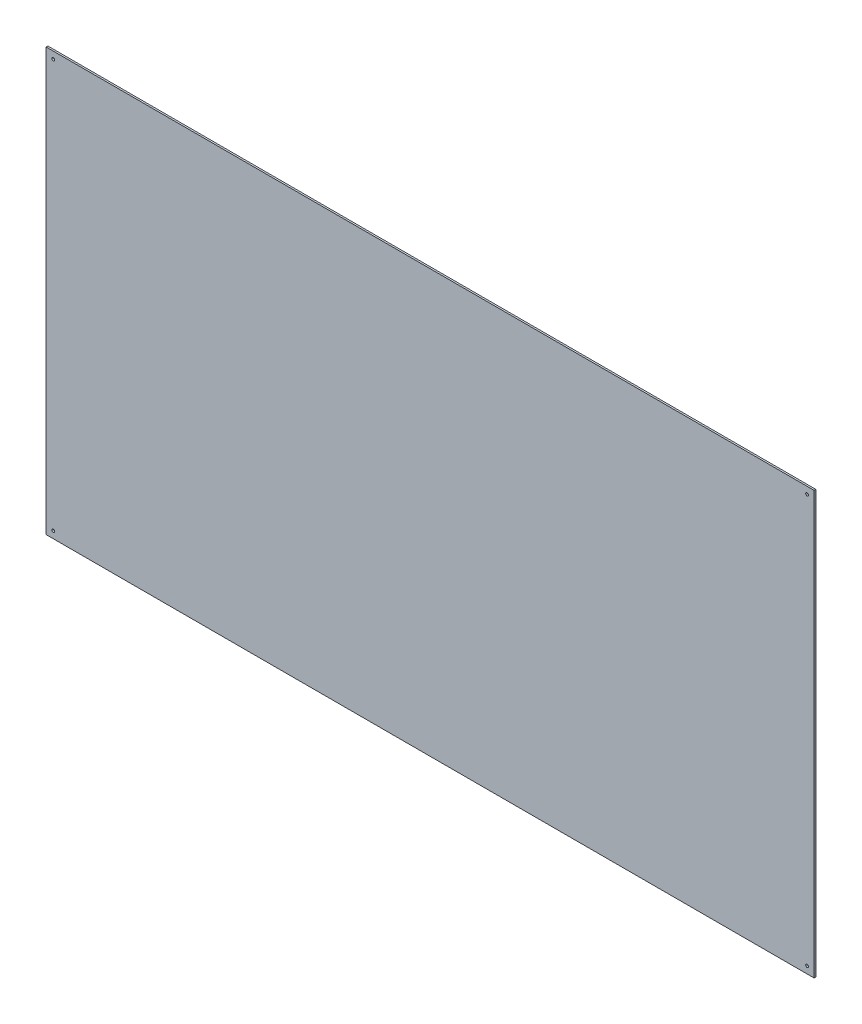
ISO-10303-21;
HEADER;
FILE_DESCRIPTION(('STEP AP214'),'2;1');
FILE_NAME('part.step','',(''),(''),'','','');
FILE_SCHEMA(('AUTOMOTIVE_DESIGN { 1 0 10303 214 1 1 1 1 }'));
ENDSEC;
DATA;
#1=APPLICATION_CONTEXT('core data for automotive mechanical design processes');
#2=APPLICATION_PROTOCOL_DEFINITION('international standard','automotive_design',2000,#1);
#3=PRODUCT_CONTEXT('',#1,'mechanical');
#4=PRODUCT('Part','Part','',(#3));
#5=PRODUCT_RELATED_PRODUCT_CATEGORY('part','',(#4));
#6=PRODUCT_DEFINITION_FORMATION('','',#4);
#7=PRODUCT_DEFINITION_CONTEXT('part definition',#1,'design');
#8=PRODUCT_DEFINITION('design','',#6,#7);
#9=PRODUCT_DEFINITION_SHAPE('','',#8);
#10=(LENGTH_UNIT() NAMED_UNIT(*) SI_UNIT(.MILLI.,.METRE.));
#11=(NAMED_UNIT(*) PLANE_ANGLE_UNIT() SI_UNIT($,.RADIAN.));
#12=(NAMED_UNIT(*) SI_UNIT($,.STERADIAN.) SOLID_ANGLE_UNIT());
#13=UNCERTAINTY_MEASURE_WITH_UNIT(LENGTH_MEASURE(1.E-05),#10,'distance_accuracy_value','');
#14=(GEOMETRIC_REPRESENTATION_CONTEXT(3) GLOBAL_UNCERTAINTY_ASSIGNED_CONTEXT((#13)) GLOBAL_UNIT_ASSIGNED_CONTEXT((#10,
#11,#12)) REPRESENTATION_CONTEXT('',''));
#15=CARTESIAN_POINT('',(0.,0.,0.));
#16=DIRECTION('',(0.,0.,1.));
#17=DIRECTION('',(1.,0.,0.));
#18=AXIS2_PLACEMENT_3D('',#15,#16,#17);
#19=CARTESIAN_POINT('',(-1100.,605.,5.));
#20=DIRECTION('',(1.,0.,0.));
#21=DIRECTION('',(0.,0.,-1.));
#22=AXIS2_PLACEMENT_3D('',#19,#20,#21);
#23=PLANE('',#22);
#24=DIRECTION('',(0.,-1.,0.));
#25=VECTOR('',#24,1.);
#26=CARTESIAN_POINT('',(-1100.,605.,0.));
#27=LINE('',#26,#25);
#28=CARTESIAN_POINT('',(-1100.,605.,0.));
#29=VERTEX_POINT('',#28);
#30=CARTESIAN_POINT('',(-1100.,-605.,0.));
#31=VERTEX_POINT('',#30);
#32=EDGE_CURVE('E96',#29,#31,#27,.T.);
#33=ORIENTED_EDGE('',*,*,#32,.T.);
#34=DIRECTION('',(0.,0.,-1.));
#35=VECTOR('',#34,1.);
#36=CARTESIAN_POINT('',(-1100.,-605.,5.));
#37=LINE('',#36,#35);
#38=CARTESIAN_POINT('',(-1100.,-605.,5.));
#39=VERTEX_POINT('',#38);
#40=EDGE_CURVE('E11',#39,#31,#37,.T.);
#41=ORIENTED_EDGE('',*,*,#40,.F.);
#42=DIRECTION('',(0.,-1.,0.));
#43=VECTOR('',#42,1.);
#44=CARTESIAN_POINT('',(-1100.,605.,5.));
#45=LINE('',#44,#43);
#46=CARTESIAN_POINT('',(-1100.,605.,5.));
#47=VERTEX_POINT('',#46);
#48=EDGE_CURVE('E84',#47,#39,#45,.T.);
#49=ORIENTED_EDGE('',*,*,#48,.F.);
#50=DIRECTION('',(0.,0.,-1.));
#51=VECTOR('',#50,1.);
#52=CARTESIAN_POINT('',(-1100.,605.,5.));
#53=LINE('',#52,#51);
#54=EDGE_CURVE('E92',#47,#29,#53,.T.);
#55=ORIENTED_EDGE('',*,*,#54,.T.);
#56=EDGE_LOOP('',(#33,#41,#49,#55));
#57=FACE_BOUND('',#56,.T.);
#58=ADVANCED_FACE('F33',(#57),#23,.F.);
#59=CARTESIAN_POINT('',(-1100.,-605.,5.));
#60=DIRECTION('',(0.,1.,0.));
#61=DIRECTION('',(-1.,0.,0.));
#62=AXIS2_PLACEMENT_3D('',#59,#60,#61);
#63=PLANE('',#62);
#64=DIRECTION('',(1.,0.,0.));
#65=VECTOR('',#64,1.);
#66=CARTESIAN_POINT('',(-1100.,-605.,0.));
#67=LINE('',#66,#65);
#68=CARTESIAN_POINT('',(1100.,-605.,0.));
#69=VERTEX_POINT('',#68);
#70=EDGE_CURVE('E88',#31,#69,#67,.T.);
#71=ORIENTED_EDGE('',*,*,#70,.T.);
#72=DIRECTION('',(0.,0.,-1.));
#73=VECTOR('',#72,1.);
#74=CARTESIAN_POINT('',(1100.,-605.,5.));
#75=LINE('',#74,#73);
#76=CARTESIAN_POINT('',(1100.,-605.,5.));
#77=VERTEX_POINT('',#76);
#78=EDGE_CURVE('E41',#77,#69,#75,.T.);
#79=ORIENTED_EDGE('',*,*,#78,.F.);
#80=DIRECTION('',(1.,0.,0.));
#81=VECTOR('',#80,1.);
#82=CARTESIAN_POINT('',(-1100.,-605.,5.));
#83=LINE('',#82,#81);
#84=EDGE_CURVE('E79',#39,#77,#83,.T.);
#85=ORIENTED_EDGE('',*,*,#84,.F.);
#86=ORIENTED_EDGE('',*,*,#40,.T.);
#87=EDGE_LOOP('',(#71,#79,#85,#86));
#88=FACE_BOUND('',#87,.T.);
#89=ADVANCED_FACE('F87',(#88),#63,.F.);
#90=CARTESIAN_POINT('',(1100.,605.,5.));
#91=DIRECTION('',(-1.,0.,0.));
#92=DIRECTION('',(0.,-1.,0.));
#93=AXIS2_PLACEMENT_3D('',#90,#91,#92);
#94=PLANE('',#93);
#95=DIRECTION('',(0.,1.,0.));
#96=VECTOR('',#95,1.);
#97=CARTESIAN_POINT('',(1100.,605.,0.));
#98=LINE('',#97,#96);
#99=CARTESIAN_POINT('',(1100.,605.,0.));
#100=VERTEX_POINT('',#99);
#101=EDGE_CURVE('E66',#69,#100,#98,.T.);
#102=ORIENTED_EDGE('',*,*,#101,.T.);
#103=DIRECTION('',(0.,0.,-1.));
#104=VECTOR('',#103,1.);
#105=CARTESIAN_POINT('',(1100.,605.,5.));
#106=LINE('',#105,#104);
#107=CARTESIAN_POINT('',(1100.,605.,5.));
#108=VERTEX_POINT('',#107);
#109=EDGE_CURVE('E89',#108,#100,#106,.T.);
#110=ORIENTED_EDGE('',*,*,#109,.F.);
#111=DIRECTION('',(0.,1.,0.));
#112=VECTOR('',#111,1.);
#113=CARTESIAN_POINT('',(1100.,605.,5.));
#114=LINE('',#113,#112);
#115=EDGE_CURVE('E82',#77,#108,#114,.T.);
#116=ORIENTED_EDGE('',*,*,#115,.F.);
#117=ORIENTED_EDGE('',*,*,#78,.T.);
#118=EDGE_LOOP('',(#102,#110,#116,#117));
#119=FACE_BOUND('',#118,.T.);
#120=ADVANCED_FACE('F90',(#119),#94,.F.);
#121=CARTESIAN_POINT('',(-1100.,605.,5.));
#122=DIRECTION('',(0.,-1.,0.));
#123=DIRECTION('',(1.,0.,0.));
#124=AXIS2_PLACEMENT_3D('',#121,#122,#123);
#125=PLANE('',#124);
#126=DIRECTION('',(-1.,0.,0.));
#127=VECTOR('',#126,1.);
#128=CARTESIAN_POINT('',(-1100.,605.,0.));
#129=LINE('',#128,#127);
#130=EDGE_CURVE('E72',#100,#29,#129,.T.);
#131=ORIENTED_EDGE('',*,*,#130,.T.);
#132=ORIENTED_EDGE('',*,*,#54,.F.);
#133=DIRECTION('',(-1.,0.,0.));
#134=VECTOR('',#133,1.);
#135=CARTESIAN_POINT('',(-1100.,605.,5.));
#136=LINE('',#135,#134);
#137=EDGE_CURVE('E49',#108,#47,#136,.T.);
#138=ORIENTED_EDGE('',*,*,#137,.F.);
#139=ORIENTED_EDGE('',*,*,#109,.T.);
#140=EDGE_LOOP('',(#131,#132,#138,#139));
#141=FACE_BOUND('',#140,.T.);
#142=ADVANCED_FACE('F104',(#141),#125,.F.);
#143=CARTESIAN_POINT('',(0.,0.,5.));
#144=DIRECTION('',(0.,0.,1.));
#145=DIRECTION('',(1.,0.,0.));
#146=AXIS2_PLACEMENT_3D('',#143,#144,#145);
#147=PLANE('',#146);
#148=CARTESIAN_POINT('',(1080.,585.,5.));
#149=DIRECTION('',(0.,0.,1.));
#150=DIRECTION('',(-1.,0.,0.));
#151=AXIS2_PLACEMENT_3D('',#148,#149,#150);
#152=CIRCLE('',#151,4.05000000000015);
#153=CARTESIAN_POINT('',(1075.95,585.,5.));
#154=VERTEX_POINT('',#153);
#155=EDGE_CURVE('E116',#154,#154,#152,.T.);
#156=ORIENTED_EDGE('',*,*,#155,.F.);
#157=EDGE_LOOP('',(#156));
#158=FACE_BOUND('',#157,.T.);
#159=CARTESIAN_POINT('',(1080.,-585.,5.));
#160=DIRECTION('',(0.,0.,1.));
#161=DIRECTION('',(1.,0.,0.));
#162=AXIS2_PLACEMENT_3D('',#159,#160,#161);
#163=CIRCLE('',#162,4.05000000000015);
#164=CARTESIAN_POINT('',(1084.05,-585.,5.));
#165=VERTEX_POINT('',#164);
#166=EDGE_CURVE('E122',#165,#165,#163,.T.);
#167=ORIENTED_EDGE('',*,*,#166,.F.);
#168=EDGE_LOOP('',(#167));
#169=FACE_BOUND('',#168,.T.);
#170=CARTESIAN_POINT('',(-1080.,-585.,5.));
#171=DIRECTION('',(0.,0.,1.));
#172=DIRECTION('',(-1.,0.,0.));
#173=AXIS2_PLACEMENT_3D('',#170,#171,#172);
#174=CIRCLE('',#173,4.05000000000015);
#175=CARTESIAN_POINT('',(-1084.05,-585.,5.));
#176=VERTEX_POINT('',#175);
#177=EDGE_CURVE('E128',#176,#176,#174,.T.);
#178=ORIENTED_EDGE('',*,*,#177,.F.);
#179=EDGE_LOOP('',(#178));
#180=FACE_BOUND('',#179,.T.);
#181=CARTESIAN_POINT('',(-1080.,585.,5.));
#182=DIRECTION('',(0.,0.,1.));
#183=DIRECTION('',(1.,0.,0.));
#184=AXIS2_PLACEMENT_3D('',#181,#182,#183);
#185=CIRCLE('',#184,4.05000000000015);
#186=CARTESIAN_POINT('',(-1075.95,585.,5.));
#187=VERTEX_POINT('',#186);
#188=EDGE_CURVE('E110',#187,#187,#185,.T.);
#189=ORIENTED_EDGE('',*,*,#188,.F.);
#190=EDGE_LOOP('',(#189));
#191=FACE_BOUND('',#190,.T.);
#192=ORIENTED_EDGE('',*,*,#48,.T.);
#193=ORIENTED_EDGE('',*,*,#84,.T.);
#194=ORIENTED_EDGE('',*,*,#115,.T.);
#195=ORIENTED_EDGE('',*,*,#137,.T.);
#196=EDGE_LOOP('',(#192,#193,#194,#195));
#197=FACE_BOUND('',#196,.T.);
#198=ADVANCED_FACE('F80',(#158,#169,#180,#191,#197),#147,.T.);
#199=CARTESIAN_POINT('',(0.,0.,0.));
#200=DIRECTION('',(0.,0.,1.));
#201=DIRECTION('',(1.,0.,0.));
#202=AXIS2_PLACEMENT_3D('',#199,#200,#201);
#203=PLANE('',#202);
#204=CARTESIAN_POINT('',(1080.,585.,0.));
#205=DIRECTION('',(0.,0.,1.));
#206=DIRECTION('',(-1.,0.,0.));
#207=AXIS2_PLACEMENT_3D('',#204,#205,#206);
#208=CIRCLE('',#207,4.05000000000015);
#209=CARTESIAN_POINT('',(1075.95,585.,0.));
#210=VERTEX_POINT('',#209);
#211=EDGE_CURVE('E119',#210,#210,#208,.T.);
#212=ORIENTED_EDGE('',*,*,#211,.T.);
#213=EDGE_LOOP('',(#212));
#214=FACE_BOUND('',#213,.T.);
#215=CARTESIAN_POINT('',(1080.,-585.,0.));
#216=DIRECTION('',(0.,0.,1.));
#217=DIRECTION('',(1.,0.,0.));
#218=AXIS2_PLACEMENT_3D('',#215,#216,#217);
#219=CIRCLE('',#218,4.05000000000015);
#220=CARTESIAN_POINT('',(1084.05,-585.,0.));
#221=VERTEX_POINT('',#220);
#222=EDGE_CURVE('E125',#221,#221,#219,.T.);
#223=ORIENTED_EDGE('',*,*,#222,.T.);
#224=EDGE_LOOP('',(#223));
#225=FACE_BOUND('',#224,.T.);
#226=CARTESIAN_POINT('',(-1080.,-585.,0.));
#227=DIRECTION('',(0.,0.,1.));
#228=DIRECTION('',(-1.,0.,0.));
#229=AXIS2_PLACEMENT_3D('',#226,#227,#228);
#230=CIRCLE('',#229,4.05000000000015);
#231=CARTESIAN_POINT('',(-1084.05,-585.,0.));
#232=VERTEX_POINT('',#231);
#233=EDGE_CURVE('E113',#232,#232,#230,.T.);
#234=ORIENTED_EDGE('',*,*,#233,.T.);
#235=EDGE_LOOP('',(#234));
#236=FACE_BOUND('',#235,.T.);
#237=CARTESIAN_POINT('',(-1080.,585.,0.));
#238=DIRECTION('',(0.,0.,1.));
#239=DIRECTION('',(1.,0.,0.));
#240=AXIS2_PLACEMENT_3D('',#237,#238,#239);
#241=CIRCLE('',#240,4.05000000000015);
#242=CARTESIAN_POINT('',(-1075.95,585.,0.));
#243=VERTEX_POINT('',#242);
#244=EDGE_CURVE('E99',#243,#243,#241,.T.);
#245=ORIENTED_EDGE('',*,*,#244,.T.);
#246=EDGE_LOOP('',(#245));
#247=FACE_BOUND('',#246,.T.);
#248=ORIENTED_EDGE('',*,*,#32,.F.);
#249=ORIENTED_EDGE('',*,*,#130,.F.);
#250=ORIENTED_EDGE('',*,*,#101,.F.);
#251=ORIENTED_EDGE('',*,*,#70,.F.);
#252=EDGE_LOOP('',(#248,#249,#250,#251));
#253=FACE_BOUND('',#252,.T.);
#254=ADVANCED_FACE('F107',(#214,#225,#236,#247,#253),#203,.F.);
#255=CARTESIAN_POINT('',(-1080.,585.,0.));
#256=DIRECTION('',(0.,0.,1.));
#257=DIRECTION('',(1.,0.,0.));
#258=AXIS2_PLACEMENT_3D('',#255,#256,#257);
#259=CYLINDRICAL_SURFACE('',#258,4.05000000000015);
#260=ORIENTED_EDGE('',*,*,#244,.F.);
#261=EDGE_LOOP('',(#260));
#262=FACE_BOUND('',#261,.T.);
#263=ORIENTED_EDGE('',*,*,#188,.T.);
#264=EDGE_LOOP('',(#263));
#265=FACE_BOUND('',#264,.T.);
#266=ADVANCED_FACE('F140',(#262,#265),#259,.F.);
#267=CARTESIAN_POINT('',(-1080.,-585.,0.));
#268=DIRECTION('',(0.,0.,1.));
#269=DIRECTION('',(1.,0.,0.));
#270=AXIS2_PLACEMENT_3D('',#267,#268,#269);
#271=CYLINDRICAL_SURFACE('',#270,4.05000000000015);
#272=ORIENTED_EDGE('',*,*,#233,.F.);
#273=EDGE_LOOP('',(#272));
#274=FACE_BOUND('',#273,.T.);
#275=ORIENTED_EDGE('',*,*,#177,.T.);
#276=EDGE_LOOP('',(#275));
#277=FACE_BOUND('',#276,.T.);
#278=ADVANCED_FACE('F136',(#274,#277),#271,.F.);
#279=CARTESIAN_POINT('',(1080.,-585.,0.));
#280=DIRECTION('',(0.,0.,1.));
#281=DIRECTION('',(1.,0.,0.));
#282=AXIS2_PLACEMENT_3D('',#279,#280,#281);
#283=CYLINDRICAL_SURFACE('',#282,4.05000000000015);
#284=ORIENTED_EDGE('',*,*,#222,.F.);
#285=EDGE_LOOP('',(#284));
#286=FACE_BOUND('',#285,.T.);
#287=ORIENTED_EDGE('',*,*,#166,.T.);
#288=EDGE_LOOP('',(#287));
#289=FACE_BOUND('',#288,.T.);
#290=ADVANCED_FACE('F139',(#286,#289),#283,.F.);
#291=CARTESIAN_POINT('',(1080.,585.,0.));
#292=DIRECTION('',(0.,0.,1.));
#293=DIRECTION('',(1.,0.,0.));
#294=AXIS2_PLACEMENT_3D('',#291,#292,#293);
#295=CYLINDRICAL_SURFACE('',#294,4.05000000000015);
#296=ORIENTED_EDGE('',*,*,#211,.F.);
#297=EDGE_LOOP('',(#296));
#298=FACE_BOUND('',#297,.T.);
#299=ORIENTED_EDGE('',*,*,#155,.T.);
#300=EDGE_LOOP('',(#299));
#301=FACE_BOUND('',#300,.T.);
#302=ADVANCED_FACE('F201',(#298,#301),#295,.F.);
#303=CLOSED_SHELL('',(#58,#89,#120,#142,#198,#254,#266,#278,#290,#302));
#304=MANIFOLD_SOLID_BREP('B2',#303);
#305=ADVANCED_BREP_SHAPE_REPRESENTATION('',(#18,#304),#14);
#306=SHAPE_DEFINITION_REPRESENTATION(#9,#305);
ENDSEC;
END-ISO-10303-21;
